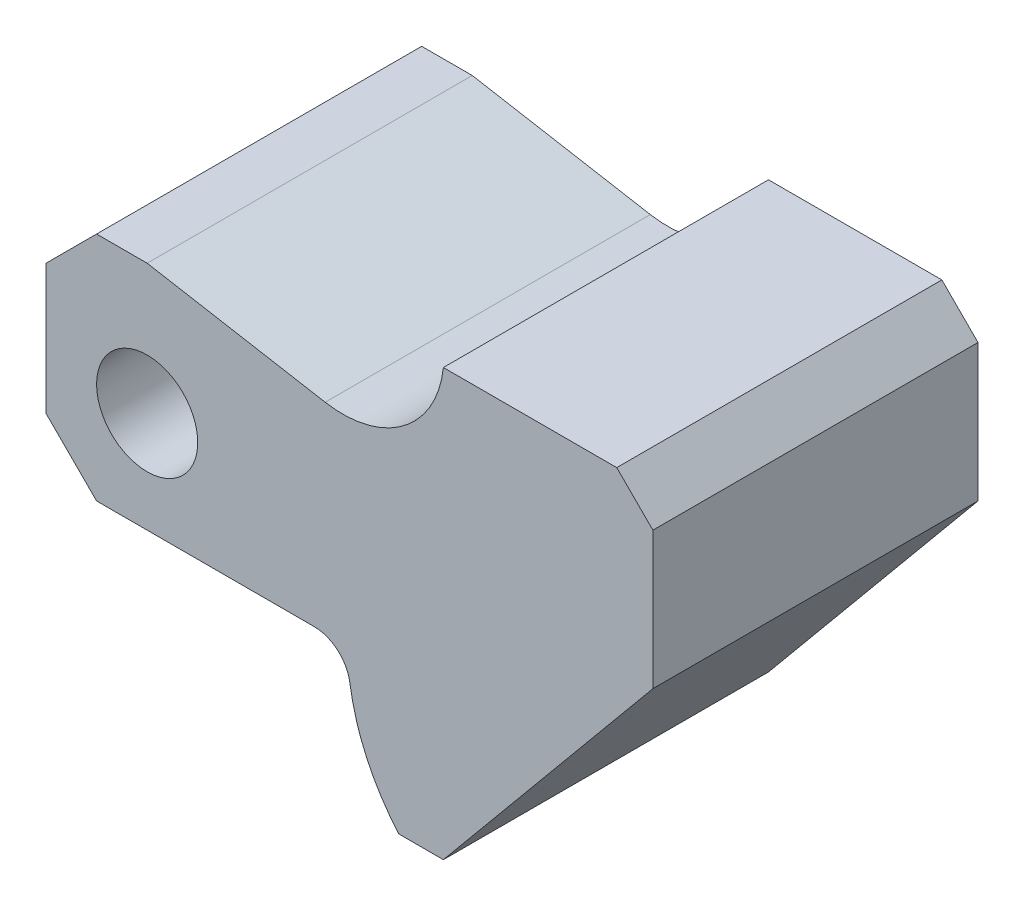
ISO-10303-21;
HEADER;
FILE_DESCRIPTION(('STEP AP214'),'2;1');
FILE_NAME('part.step','',(''),(''),'','','');
FILE_SCHEMA(('AUTOMOTIVE_DESIGN { 1 0 10303 214 1 1 1 1 }'));
ENDSEC;
DATA;
#1=APPLICATION_CONTEXT('core data for automotive mechanical design processes');
#2=APPLICATION_PROTOCOL_DEFINITION('international standard','automotive_design',2000,#1);
#3=PRODUCT_CONTEXT('',#1,'mechanical');
#4=PRODUCT('Part','Part','',(#3));
#5=PRODUCT_RELATED_PRODUCT_CATEGORY('part','',(#4));
#6=PRODUCT_DEFINITION_FORMATION('','',#4);
#7=PRODUCT_DEFINITION_CONTEXT('part definition',#1,'design');
#8=PRODUCT_DEFINITION('design','',#6,#7);
#9=PRODUCT_DEFINITION_SHAPE('','',#8);
#10=(LENGTH_UNIT() NAMED_UNIT(*) SI_UNIT(.MILLI.,.METRE.));
#11=(NAMED_UNIT(*) PLANE_ANGLE_UNIT() SI_UNIT($,.RADIAN.));
#12=(NAMED_UNIT(*) SI_UNIT($,.STERADIAN.) SOLID_ANGLE_UNIT());
#13=UNCERTAINTY_MEASURE_WITH_UNIT(LENGTH_MEASURE(1.E-05),#10,'distance_accuracy_value','');
#14=(GEOMETRIC_REPRESENTATION_CONTEXT(3) GLOBAL_UNCERTAINTY_ASSIGNED_CONTEXT((#13)) GLOBAL_UNIT_ASSIGNED_CONTEXT((#10,
#11,#12)) REPRESENTATION_CONTEXT('',''));
#15=CARTESIAN_POINT('',(0.,0.,0.));
#16=DIRECTION('',(0.,0.,1.));
#17=DIRECTION('',(1.,0.,0.));
#18=AXIS2_PLACEMENT_3D('',#15,#16,#17);
#19=CARTESIAN_POINT('',(-42.867935385469,-6.63350003125649,45.));
#20=DIRECTION('',(0.,0.,-1.));
#21=DIRECTION('',(-1.,0.,0.));
#22=AXIS2_PLACEMENT_3D('',#19,#20,#21);
#23=CYLINDRICAL_SURFACE('',#22,5.);
#24=CARTESIAN_POINT('',(-42.867935385469,-6.63350003125649,0.));
#25=DIRECTION('',(0.,0.,1.));
#26=DIRECTION('',(1.,0.,0.));
#27=AXIS2_PLACEMENT_3D('',#24,#25,#26);
#28=CIRCLE('',#27,5.);
#29=CARTESIAN_POINT('',(-42.867935385469,-1.63350003125649,0.));
#30=VERTEX_POINT('',#29);
#31=CARTESIAN_POINT('',(-37.9222966440572,-5.89820591360943,0.));
#32=VERTEX_POINT('',#31);
#33=EDGE_CURVE('E184',#30,#32,#28,.F.);
#34=ORIENTED_EDGE('',*,*,#33,.T.);
#35=DIRECTION('',(0.,0.,-1.));
#36=VECTOR('',#35,1.);
#37=CARTESIAN_POINT('',(-37.9222966440572,-5.89820591360943,45.));
#38=LINE('',#37,#36);
#39=CARTESIAN_POINT('',(-37.9222966440572,-5.89820591360943,45.));
#40=VERTEX_POINT('',#39);
#41=EDGE_CURVE('E11',#40,#32,#38,.T.);
#42=ORIENTED_EDGE('',*,*,#41,.F.);
#43=CARTESIAN_POINT('',(-42.867935385469,-6.63350003125649,45.));
#44=DIRECTION('',(0.,0.,1.));
#45=DIRECTION('',(1.,0.,0.));
#46=AXIS2_PLACEMENT_3D('',#43,#44,#45);
#47=CIRCLE('',#46,5.);
#48=CARTESIAN_POINT('',(-42.867935385469,-1.63350003125649,45.));
#49=VERTEX_POINT('',#48);
#50=EDGE_CURVE('E431',#49,#40,#47,.F.);
#51=ORIENTED_EDGE('',*,*,#50,.F.);
#52=DIRECTION('',(0.,0.,-1.));
#53=VECTOR('',#52,1.);
#54=CARTESIAN_POINT('',(-42.867935385469,-1.63350003125649,45.));
#55=LINE('',#54,#53);
#56=EDGE_CURVE('E176',#49,#30,#55,.T.);
#57=ORIENTED_EDGE('',*,*,#56,.T.);
#58=EDGE_LOOP('',(#34,#42,#51,#57));
#59=FACE_BOUND('',#58,.T.);
#60=ADVANCED_FACE('F41',(#59),#23,.F.);
#61=CARTESIAN_POINT('',(-9.23759194386856,-1.63350003125649,45.));
#62=DIRECTION('',(0.,0.,-1.));
#63=DIRECTION('',(-1.,0.,0.));
#64=AXIS2_PLACEMENT_3D('',#61,#62,#63);
#65=CYLINDRICAL_SURFACE('',#64,29.);
#66=CARTESIAN_POINT('',(-9.23759194386856,-1.63350003125649,0.));
#67=DIRECTION('',(0.,0.,1.));
#68=DIRECTION('',(1.,0.,0.));
#69=AXIS2_PLACEMENT_3D('',#66,#67,#68);
#70=CIRCLE('',#69,29.);
#71=CARTESIAN_POINT('',(-31.1464942440752,-20.6335000312565,0.));
#72=VERTEX_POINT('',#71);
#73=EDGE_CURVE('E188',#32,#72,#70,.T.);
#74=ORIENTED_EDGE('',*,*,#73,.T.);
#75=DIRECTION('',(0.,0.,-1.));
#76=VECTOR('',#75,1.);
#77=CARTESIAN_POINT('',(-31.1464942440752,-20.6335000312565,45.));
#78=LINE('',#77,#76);
#79=CARTESIAN_POINT('',(-31.1464942440752,-20.6335000312565,45.));
#80=VERTEX_POINT('',#79);
#81=EDGE_CURVE('E51',#80,#72,#78,.T.);
#82=ORIENTED_EDGE('',*,*,#81,.F.);
#83=CARTESIAN_POINT('',(-9.23759194386856,-1.63350003125649,45.));
#84=DIRECTION('',(0.,0.,1.));
#85=DIRECTION('',(1.,0.,0.));
#86=AXIS2_PLACEMENT_3D('',#83,#84,#85);
#87=CIRCLE('',#86,29.);
#88=EDGE_CURVE('E120',#40,#80,#87,.T.);
#89=ORIENTED_EDGE('',*,*,#88,.F.);
#90=ORIENTED_EDGE('',*,*,#41,.T.);
#91=EDGE_LOOP('',(#74,#82,#89,#90));
#92=FACE_BOUND('',#91,.T.);
#93=ADVANCED_FACE('F333',(#92),#65,.T.);
#94=CARTESIAN_POINT('',(0.,-20.6335000312565,45.));
#95=DIRECTION('',(0.,1.,0.));
#96=DIRECTION('',(0.,0.,1.));
#97=AXIS2_PLACEMENT_3D('',#94,#95,#96);
#98=PLANE('',#97);
#99=DIRECTION('',(1.,0.,0.));
#100=VECTOR('',#99,1.);
#101=CARTESIAN_POINT('',(0.,-20.6335000312565,0.));
#102=LINE('',#101,#100);
#103=CARTESIAN_POINT('',(-24.9804490867257,-20.6335000312565,0.));
#104=VERTEX_POINT('',#103);
#105=EDGE_CURVE('E191',#72,#104,#102,.T.);
#106=ORIENTED_EDGE('',*,*,#105,.T.);
#107=DIRECTION('',(0.,0.,-1.));
#108=VECTOR('',#107,1.);
#109=CARTESIAN_POINT('',(-24.9804490867257,-20.6335000312565,45.));
#110=LINE('',#109,#108);
#111=CARTESIAN_POINT('',(-24.9804490867257,-20.6335000312565,45.));
#112=VERTEX_POINT('',#111);
#113=EDGE_CURVE('E260',#112,#104,#110,.T.);
#114=ORIENTED_EDGE('',*,*,#113,.F.);
#115=DIRECTION('',(1.,0.,0.));
#116=VECTOR('',#115,1.);
#117=CARTESIAN_POINT('',(0.,-20.6335000312565,45.));
#118=LINE('',#117,#116);
#119=EDGE_CURVE('E269',#80,#112,#118,.T.);
#120=ORIENTED_EDGE('',*,*,#119,.F.);
#121=ORIENTED_EDGE('',*,*,#81,.T.);
#122=EDGE_LOOP('',(#106,#114,#120,#121));
#123=FACE_BOUND('',#122,.T.);
#124=ADVANCED_FACE('F267',(#123),#98,.F.);
#125=CARTESIAN_POINT('',(-4.67475682454678,3.87336994033876,45.));
#126=DIRECTION('',(0.770021560905562,-0.638017864750323,0.));
#127=DIRECTION('',(0.638017864750323,0.770021560905562,0.));
#128=AXIS2_PLACEMENT_3D('',#125,#126,#127);
#129=PLANE('',#128);
#130=DIRECTION('',(-0.638017864750323,-0.770021560905562,0.));
#131=VECTOR('',#130,1.);
#132=CARTESIAN_POINT('',(-4.67475682454678,3.87336994033876,0.));
#133=LINE('',#132,#131);
#134=CARTESIAN_POINT('',(4.0195509132743,14.3664999687435,0.));
#135=VERTEX_POINT('',#134);
#136=EDGE_CURVE('E195',#135,#104,#133,.T.);
#137=ORIENTED_EDGE('',*,*,#136,.F.);
#138=DIRECTION('',(0.,0.,-1.));
#139=VECTOR('',#138,1.);
#140=CARTESIAN_POINT('',(4.0195509132743,14.3664999687435,45.));
#141=LINE('',#140,#139);
#142=CARTESIAN_POINT('',(4.0195509132743,14.3664999687435,45.));
#143=VERTEX_POINT('',#142);
#144=EDGE_CURVE('E257',#143,#135,#141,.T.);
#145=ORIENTED_EDGE('',*,*,#144,.F.);
#146=DIRECTION('',(-0.638017864750323,-0.770021560905562,0.));
#147=VECTOR('',#146,1.);
#148=CARTESIAN_POINT('',(-4.67475682454678,3.87336994033876,45.));
#149=LINE('',#148,#147);
#150=EDGE_CURVE('E279',#143,#112,#149,.T.);
#151=ORIENTED_EDGE('',*,*,#150,.T.);
#152=ORIENTED_EDGE('',*,*,#113,.T.);
#153=EDGE_LOOP('',(#137,#145,#151,#152));
#154=FACE_BOUND('',#153,.T.);
#155=ADVANCED_FACE('F276',(#154),#129,.T.);
#156=CARTESIAN_POINT('',(4.0195509132743,0.,45.));
#157=DIRECTION('',(1.,0.,0.));
#158=DIRECTION('',(0.,1.,0.));
#159=AXIS2_PLACEMENT_3D('',#156,#157,#158);
#160=PLANE('',#159);
#161=DIRECTION('',(0.,-1.,0.));
#162=VECTOR('',#161,1.);
#163=CARTESIAN_POINT('',(4.0195509132743,0.,0.));
#164=LINE('',#163,#162);
#165=CARTESIAN_POINT('',(4.0195509132743,33.3664999687435,0.));
#166=VERTEX_POINT('',#165);
#167=EDGE_CURVE('E199',#166,#135,#164,.T.);
#168=ORIENTED_EDGE('',*,*,#167,.F.);
#169=DIRECTION('',(0.,0.,-1.));
#170=VECTOR('',#169,1.);
#171=CARTESIAN_POINT('',(4.0195509132743,33.3664999687435,45.));
#172=LINE('',#171,#170);
#173=CARTESIAN_POINT('',(4.0195509132743,33.3664999687435,45.));
#174=VERTEX_POINT('',#173);
#175=EDGE_CURVE('E254',#174,#166,#172,.T.);
#176=ORIENTED_EDGE('',*,*,#175,.F.);
#177=DIRECTION('',(0.,-1.,0.));
#178=VECTOR('',#177,1.);
#179=CARTESIAN_POINT('',(4.0195509132743,0.,45.));
#180=LINE('',#179,#178);
#181=EDGE_CURVE('E283',#174,#143,#180,.T.);
#182=ORIENTED_EDGE('',*,*,#181,.T.);
#183=ORIENTED_EDGE('',*,*,#144,.T.);
#184=EDGE_LOOP('',(#168,#176,#182,#183));
#185=FACE_BOUND('',#184,.T.);
#186=ADVANCED_FACE('F344',(#185),#160,.T.);
#187=CARTESIAN_POINT('',(18.6930254410089,18.6930254410089,45.));
#188=DIRECTION('',(0.707106781186547,0.707106781186547,0.));
#189=DIRECTION('',(-0.707106781186548,0.707106781186548,0.));
#190=AXIS2_PLACEMENT_3D('',#187,#188,#189);
#191=PLANE('',#190);
#192=DIRECTION('',(0.707106781186548,-0.707106781186548,0.));
#193=VECTOR('',#192,1.);
#194=CARTESIAN_POINT('',(18.6930254410089,18.6930254410089,0.));
#195=LINE('',#194,#193);
#196=CARTESIAN_POINT('',(-0.9804490867257,38.3664999687435,0.));
#197=VERTEX_POINT('',#196);
#198=EDGE_CURVE('E203',#197,#166,#195,.T.);
#199=ORIENTED_EDGE('',*,*,#198,.F.);
#200=DIRECTION('',(0.,0.,-1.));
#201=VECTOR('',#200,1.);
#202=CARTESIAN_POINT('',(-0.9804490867257,38.3664999687435,45.));
#203=LINE('',#202,#201);
#204=CARTESIAN_POINT('',(-0.9804490867257,38.3664999687435,45.));
#205=VERTEX_POINT('',#204);
#206=EDGE_CURVE('E251',#205,#197,#203,.T.);
#207=ORIENTED_EDGE('',*,*,#206,.F.);
#208=DIRECTION('',(0.707106781186548,-0.707106781186548,0.));
#209=VECTOR('',#208,1.);
#210=CARTESIAN_POINT('',(18.6930254410089,18.6930254410089,45.));
#211=LINE('',#210,#209);
#212=EDGE_CURVE('E287',#205,#174,#211,.T.);
#213=ORIENTED_EDGE('',*,*,#212,.T.);
#214=ORIENTED_EDGE('',*,*,#175,.T.);
#215=EDGE_LOOP('',(#199,#207,#213,#214));
#216=FACE_BOUND('',#215,.T.);
#217=ADVANCED_FACE('F347',(#216),#191,.T.);
#218=CARTESIAN_POINT('',(0.,38.3664999687435,45.));
#219=DIRECTION('',(0.,1.,0.));
#220=DIRECTION('',(0.,0.,1.));
#221=AXIS2_PLACEMENT_3D('',#218,#219,#220);
#222=PLANE('',#221);
#223=DIRECTION('',(1.,0.,0.));
#224=VECTOR('',#223,1.);
#225=CARTESIAN_POINT('',(0.,38.3664999687435,0.));
#226=LINE('',#225,#224);
#227=CARTESIAN_POINT('',(-24.9804490867257,38.3664999687435,0.));
#228=VERTEX_POINT('',#227);
#229=EDGE_CURVE('E207',#228,#197,#226,.T.);
#230=ORIENTED_EDGE('',*,*,#229,.F.);
#231=DIRECTION('',(0.,0.,-1.));
#232=VECTOR('',#231,1.);
#233=CARTESIAN_POINT('',(-24.9804490867257,38.3664999687435,45.));
#234=LINE('',#233,#232);
#235=CARTESIAN_POINT('',(-24.9804490867257,38.3664999687435,45.));
#236=VERTEX_POINT('',#235);
#237=EDGE_CURVE('E248',#236,#228,#234,.T.);
#238=ORIENTED_EDGE('',*,*,#237,.F.);
#239=DIRECTION('',(1.,0.,0.));
#240=VECTOR('',#239,1.);
#241=CARTESIAN_POINT('',(0.,38.3664999687435,45.));
#242=LINE('',#241,#240);
#243=EDGE_CURVE('E295',#236,#205,#242,.T.);
#244=ORIENTED_EDGE('',*,*,#243,.T.);
#245=ORIENTED_EDGE('',*,*,#206,.T.);
#246=EDGE_LOOP('',(#230,#238,#244,#245));
#247=FACE_BOUND('',#246,.T.);
#248=ADVANCED_FACE('F351',(#247),#222,.T.);
#249=CARTESIAN_POINT('',(-38.9059865860506,39.8085143080953,45.));
#250=DIRECTION('',(0.,0.,-1.));
#251=DIRECTION('',(-1.,0.,0.));
#252=AXIS2_PLACEMENT_3D('',#249,#250,#251);
#253=CYLINDRICAL_SURFACE('',#252,14.);
#254=CARTESIAN_POINT('',(-38.9059865860506,39.8085143080953,0.));
#255=DIRECTION('',(0.,0.,1.));
#256=DIRECTION('',(1.,0.,0.));
#257=AXIS2_PLACEMENT_3D('',#254,#255,#256);
#258=CIRCLE('',#257,14.);
#259=CARTESIAN_POINT('',(-41.3370610733876,26.0212057659244,0.));
#260=VERTEX_POINT('',#259);
#261=EDGE_CURVE('E211',#260,#228,#258,.T.);
#262=ORIENTED_EDGE('',*,*,#261,.F.);
#263=DIRECTION('',(0.,0.,-1.));
#264=VECTOR('',#263,1.);
#265=CARTESIAN_POINT('',(-41.3370610733876,26.0212057659244,45.));
#266=LINE('',#265,#264);
#267=CARTESIAN_POINT('',(-41.3370610733876,26.0212057659244,45.));
#268=VERTEX_POINT('',#267);
#269=EDGE_CURVE('E245',#268,#260,#266,.T.);
#270=ORIENTED_EDGE('',*,*,#269,.F.);
#271=CARTESIAN_POINT('',(-38.9059865860506,39.8085143080953,45.));
#272=DIRECTION('',(0.,0.,1.));
#273=DIRECTION('',(1.,0.,0.));
#274=AXIS2_PLACEMENT_3D('',#271,#272,#273);
#275=CIRCLE('',#274,14.);
#276=EDGE_CURVE('E299',#268,#236,#275,.T.);
#277=ORIENTED_EDGE('',*,*,#276,.T.);
#278=ORIENTED_EDGE('',*,*,#237,.T.);
#279=EDGE_LOOP('',(#262,#270,#277,#278));
#280=FACE_BOUND('',#279,.T.);
#281=ADVANCED_FACE('F355',(#280),#253,.F.);
#282=CARTESIAN_POINT('',(3.20342335390967,18.1675166275667,45.));
#283=DIRECTION('',(0.173648177666931,0.984807753012208,0.));
#284=DIRECTION('',(-0.984807753012208,0.173648177666931,0.));
#285=AXIS2_PLACEMENT_3D('',#282,#283,#284);
#286=PLANE('',#285);
#287=DIRECTION('',(0.984807753012208,-0.173648177666931,0.));
#288=VECTOR('',#287,1.);
#289=CARTESIAN_POINT('',(3.20342335390967,18.1675166275667,0.));
#290=LINE('',#289,#288);
#291=CARTESIAN_POINT('',(-65.9804490867257,30.3664999687435,0.));
#292=VERTEX_POINT('',#291);
#293=EDGE_CURVE('E215',#292,#260,#290,.T.);
#294=ORIENTED_EDGE('',*,*,#293,.F.);
#295=DIRECTION('',(0.,0.,-1.));
#296=VECTOR('',#295,1.);
#297=CARTESIAN_POINT('',(-65.9804490867257,30.3664999687435,45.));
#298=LINE('',#297,#296);
#299=CARTESIAN_POINT('',(-65.9804490867257,30.3664999687435,45.));
#300=VERTEX_POINT('',#299);
#301=EDGE_CURVE('E242',#300,#292,#298,.T.);
#302=ORIENTED_EDGE('',*,*,#301,.F.);
#303=DIRECTION('',(0.984807753012208,-0.173648177666931,0.));
#304=VECTOR('',#303,1.);
#305=CARTESIAN_POINT('',(3.20342335390967,18.1675166275667,45.));
#306=LINE('',#305,#304);
#307=EDGE_CURVE('E303',#300,#268,#306,.T.);
#308=ORIENTED_EDGE('',*,*,#307,.T.);
#309=ORIENTED_EDGE('',*,*,#269,.T.);
#310=EDGE_LOOP('',(#294,#302,#308,#309));
#311=FACE_BOUND('',#310,.T.);
#312=ADVANCED_FACE('F319',(#311),#286,.T.);
#313=CARTESIAN_POINT('',(0.,30.3664999687435,45.));
#314=DIRECTION('',(0.,1.,0.));
#315=DIRECTION('',(0.,0.,1.));
#316=AXIS2_PLACEMENT_3D('',#313,#314,#315);
#317=PLANE('',#316);
#318=DIRECTION('',(1.,0.,0.));
#319=VECTOR('',#318,1.);
#320=CARTESIAN_POINT('',(0.,30.3664999687435,0.));
#321=LINE('',#320,#319);
#322=CARTESIAN_POINT('',(-72.9804490867257,30.3664999687435,0.));
#323=VERTEX_POINT('',#322);
#324=EDGE_CURVE('E219',#323,#292,#321,.T.);
#325=ORIENTED_EDGE('',*,*,#324,.F.);
#326=DIRECTION('',(0.,0.,-1.));
#327=VECTOR('',#326,1.);
#328=CARTESIAN_POINT('',(-72.9804490867257,30.3664999687435,45.));
#329=LINE('',#328,#327);
#330=CARTESIAN_POINT('',(-72.9804490867257,30.3664999687435,45.));
#331=VERTEX_POINT('',#330);
#332=EDGE_CURVE('E239',#331,#323,#329,.T.);
#333=ORIENTED_EDGE('',*,*,#332,.F.);
#334=DIRECTION('',(1.,0.,0.));
#335=VECTOR('',#334,1.);
#336=CARTESIAN_POINT('',(0.,30.3664999687435,45.));
#337=LINE('',#336,#335);
#338=EDGE_CURVE('E307',#331,#300,#337,.T.);
#339=ORIENTED_EDGE('',*,*,#338,.T.);
#340=ORIENTED_EDGE('',*,*,#301,.T.);
#341=EDGE_LOOP('',(#325,#333,#339,#340));
#342=FACE_BOUND('',#341,.T.);
#343=ADVANCED_FACE('F313',(#342),#317,.T.);
#344=CARTESIAN_POINT('',(-51.6734745277346,51.6734745277346,45.));
#345=DIRECTION('',(0.707106781186548,-0.707106781186547,0.));
#346=DIRECTION('',(0.707106781186547,0.707106781186548,0.));
#347=AXIS2_PLACEMENT_3D('',#344,#345,#346);
#348=PLANE('',#347);
#349=DIRECTION('',(-0.707106781186547,-0.707106781186548,0.));
#350=VECTOR('',#349,1.);
#351=CARTESIAN_POINT('',(-51.6734745277346,51.6734745277346,0.));
#352=LINE('',#351,#350);
#353=CARTESIAN_POINT('',(-79.9804490867257,23.3664999687435,0.));
#354=VERTEX_POINT('',#353);
#355=EDGE_CURVE('E223',#323,#354,#352,.T.);
#356=ORIENTED_EDGE('',*,*,#355,.T.);
#357=DIRECTION('',(0.,0.,-1.));
#358=VECTOR('',#357,1.);
#359=CARTESIAN_POINT('',(-79.9804490867257,23.3664999687435,45.));
#360=LINE('',#359,#358);
#361=CARTESIAN_POINT('',(-79.9804490867257,23.3664999687435,45.));
#362=VERTEX_POINT('',#361);
#363=EDGE_CURVE('E169',#362,#354,#360,.T.);
#364=ORIENTED_EDGE('',*,*,#363,.F.);
#365=DIRECTION('',(-0.707106781186547,-0.707106781186548,0.));
#366=VECTOR('',#365,1.);
#367=CARTESIAN_POINT('',(-51.6734745277346,51.6734745277346,45.));
#368=LINE('',#367,#366);
#369=EDGE_CURVE('E158',#331,#362,#368,.T.);
#370=ORIENTED_EDGE('',*,*,#369,.F.);
#371=ORIENTED_EDGE('',*,*,#332,.T.);
#372=EDGE_LOOP('',(#356,#364,#370,#371));
#373=FACE_BOUND('',#372,.T.);
#374=ADVANCED_FACE('F323',(#373),#348,.F.);
#375=CARTESIAN_POINT('',(-79.9804490867257,0.,45.));
#376=DIRECTION('',(1.,0.,0.));
#377=DIRECTION('',(0.,1.,0.));
#378=AXIS2_PLACEMENT_3D('',#375,#376,#377);
#379=PLANE('',#378);
#380=DIRECTION('',(0.,-1.,0.));
#381=VECTOR('',#380,1.);
#382=CARTESIAN_POINT('',(-79.9804490867257,0.,0.));
#383=LINE('',#382,#381);
#384=CARTESIAN_POINT('',(-79.9804490867257,5.36649996874351,0.));
#385=VERTEX_POINT('',#384);
#386=EDGE_CURVE('E167',#354,#385,#383,.T.);
#387=ORIENTED_EDGE('',*,*,#386,.T.);
#388=DIRECTION('',(0.,0.,-1.));
#389=VECTOR('',#388,1.);
#390=CARTESIAN_POINT('',(-79.9804490867257,5.36649996874351,45.));
#391=LINE('',#390,#389);
#392=CARTESIAN_POINT('',(-79.9804490867257,5.36649996874351,45.));
#393=VERTEX_POINT('',#392);
#394=EDGE_CURVE('E164',#393,#385,#391,.T.);
#395=ORIENTED_EDGE('',*,*,#394,.F.);
#396=DIRECTION('',(0.,-1.,0.));
#397=VECTOR('',#396,1.);
#398=CARTESIAN_POINT('',(-79.9804490867257,0.,45.));
#399=LINE('',#398,#397);
#400=EDGE_CURVE('E151',#362,#393,#399,.T.);
#401=ORIENTED_EDGE('',*,*,#400,.F.);
#402=ORIENTED_EDGE('',*,*,#363,.T.);
#403=EDGE_LOOP('',(#387,#395,#401,#402));
#404=FACE_BOUND('',#403,.T.);
#405=ADVANCED_FACE('F165',(#404),#379,.F.);
#406=CARTESIAN_POINT('',(-37.306974558991,-37.3069745589911,45.));
#407=DIRECTION('',(0.707106781186546,0.707106781186548,0.));
#408=DIRECTION('',(-0.707106781186549,0.707106781186547,0.));
#409=AXIS2_PLACEMENT_3D('',#406,#407,#408);
#410=PLANE('',#409);
#411=DIRECTION('',(0.707106781186549,-0.707106781186547,0.));
#412=VECTOR('',#411,1.);
#413=CARTESIAN_POINT('',(-37.306974558991,-37.3069745589911,0.));
#414=LINE('',#413,#412);
#415=CARTESIAN_POINT('',(-72.9804490867257,-1.63350003125649,0.));
#416=VERTEX_POINT('',#415);
#417=EDGE_CURVE('E106',#385,#416,#414,.T.);
#418=ORIENTED_EDGE('',*,*,#417,.T.);
#419=DIRECTION('',(0.,0.,-1.));
#420=VECTOR('',#419,1.);
#421=CARTESIAN_POINT('',(-72.9804490867257,-1.63350003125649,45.));
#422=LINE('',#421,#420);
#423=CARTESIAN_POINT('',(-72.9804490867257,-1.63350003125649,45.));
#424=VERTEX_POINT('',#423);
#425=EDGE_CURVE('E170',#424,#416,#422,.T.);
#426=ORIENTED_EDGE('',*,*,#425,.F.);
#427=DIRECTION('',(0.707106781186549,-0.707106781186547,0.));
#428=VECTOR('',#427,1.);
#429=CARTESIAN_POINT('',(-37.306974558991,-37.3069745589911,45.));
#430=LINE('',#429,#428);
#431=EDGE_CURVE('E155',#393,#424,#430,.T.);
#432=ORIENTED_EDGE('',*,*,#431,.F.);
#433=ORIENTED_EDGE('',*,*,#394,.T.);
#434=EDGE_LOOP('',(#418,#426,#432,#433));
#435=FACE_BOUND('',#434,.T.);
#436=ADVANCED_FACE('F172',(#435),#410,.F.);
#437=CARTESIAN_POINT('',(-65.9804490867257,12.3664999687435,45.));
#438=DIRECTION('',(0.,0.,-1.));
#439=DIRECTION('',(-1.,0.,0.));
#440=AXIS2_PLACEMENT_3D('',#437,#438,#439);
#441=CYLINDRICAL_SURFACE('',#440,7.);
#442=CARTESIAN_POINT('',(-65.9804490867257,12.3664999687435,45.));
#443=DIRECTION('',(0.,0.,1.));
#444=DIRECTION('',(1.,0.,0.));
#445=AXIS2_PLACEMENT_3D('',#442,#443,#444);
#446=CIRCLE('',#445,7.);
#447=CARTESIAN_POINT('',(-72.9804490867257,12.3664999687435,45.));
#448=VERTEX_POINT('',#447);
#449=EDGE_CURVE('E232',#448,#448,#446,.T.);
#450=CARTESIAN_POINT('',(-65.9804490867257,12.3664999687435,0.));
#451=DIRECTION('',(0.,0.,1.));
#452=DIRECTION('',(1.,0.,0.));
#453=AXIS2_PLACEMENT_3D('',#450,#451,#452);
#454=CIRCLE('',#453,7.);
#455=CARTESIAN_POINT('',(-72.9804490867257,12.3664999687435,0.));
#456=VERTEX_POINT('',#455);
#457=EDGE_CURVE('E180',#456,#456,#454,.T.);
#458=CARTESIAN_POINT('',(-72.9804490867257,12.3664999687435,45.));
#459=CARTESIAN_POINT('',(-72.9804490867257,12.3664999687435,44.53125));
#460=CARTESIAN_POINT('',(-72.9804490867257,12.3664999687435,44.0625));
#461=CARTESIAN_POINT('',(-72.9804490867257,12.3664999687435,43.125));
#462=CARTESIAN_POINT('',(-72.9804490867257,12.3664999687435,42.65625));
#463=CARTESIAN_POINT('',(-72.9804490867257,12.3664999687435,41.71875));
#464=CARTESIAN_POINT('',(-72.9804490867257,12.3664999687435,41.25));
#465=CARTESIAN_POINT('',(-72.9804490867257,12.3664999687435,40.3125));
#466=CARTESIAN_POINT('',(-72.9804490867257,12.3664999687435,39.84375));
#467=CARTESIAN_POINT('',(-72.9804490867257,12.3664999687435,38.90625));
#468=CARTESIAN_POINT('',(-72.9804490867257,12.3664999687435,38.4375));
#469=CARTESIAN_POINT('',(-72.9804490867257,12.3664999687435,37.5));
#470=CARTESIAN_POINT('',(-72.9804490867257,12.3664999687435,37.03125));
#471=CARTESIAN_POINT('',(-72.9804490867257,12.3664999687435,36.09375));
#472=CARTESIAN_POINT('',(-72.9804490867257,12.3664999687435,35.625));
#473=CARTESIAN_POINT('',(-72.9804490867257,12.3664999687435,34.6875));
#474=CARTESIAN_POINT('',(-72.9804490867257,12.3664999687435,34.21875));
#475=CARTESIAN_POINT('',(-72.9804490867257,12.3664999687435,33.28125));
#476=CARTESIAN_POINT('',(-72.9804490867257,12.3664999687435,32.8125));
#477=CARTESIAN_POINT('',(-72.9804490867257,12.3664999687435,31.875));
#478=CARTESIAN_POINT('',(-72.9804490867257,12.3664999687435,31.40625));
#479=CARTESIAN_POINT('',(-72.9804490867257,12.3664999687435,30.46875));
#480=CARTESIAN_POINT('',(-72.9804490867257,12.3664999687435,30.));
#481=CARTESIAN_POINT('',(-72.9804490867257,12.3664999687435,29.0625));
#482=CARTESIAN_POINT('',(-72.9804490867257,12.3664999687435,28.59375));
#483=CARTESIAN_POINT('',(-72.9804490867257,12.3664999687435,27.65625));
#484=CARTESIAN_POINT('',(-72.9804490867257,12.3664999687435,27.1875));
#485=CARTESIAN_POINT('',(-72.9804490867257,12.3664999687435,26.25));
#486=CARTESIAN_POINT('',(-72.9804490867257,12.3664999687435,25.78125));
#487=CARTESIAN_POINT('',(-72.9804490867257,12.3664999687435,24.84375));
#488=CARTESIAN_POINT('',(-72.9804490867257,12.3664999687435,24.375));
#489=CARTESIAN_POINT('',(-72.9804490867257,12.3664999687435,23.4375));
#490=CARTESIAN_POINT('',(-72.9804490867257,12.3664999687435,22.96875));
#491=CARTESIAN_POINT('',(-72.9804490867257,12.3664999687435,22.03125));
#492=CARTESIAN_POINT('',(-72.9804490867257,12.3664999687435,21.5625));
#493=CARTESIAN_POINT('',(-72.9804490867257,12.3664999687435,20.625));
#494=CARTESIAN_POINT('',(-72.9804490867257,12.3664999687435,20.15625));
#495=CARTESIAN_POINT('',(-72.9804490867257,12.3664999687435,19.21875));
#496=CARTESIAN_POINT('',(-72.9804490867257,12.3664999687435,18.75));
#497=CARTESIAN_POINT('',(-72.9804490867257,12.3664999687435,17.8125));
#498=CARTESIAN_POINT('',(-72.9804490867257,12.3664999687435,17.34375));
#499=CARTESIAN_POINT('',(-72.9804490867257,12.3664999687435,16.40625));
#500=CARTESIAN_POINT('',(-72.9804490867257,12.3664999687435,15.9375));
#501=CARTESIAN_POINT('',(-72.9804490867257,12.3664999687435,15.));
#502=CARTESIAN_POINT('',(-72.9804490867257,12.3664999687435,14.53125));
#503=CARTESIAN_POINT('',(-72.9804490867257,12.3664999687435,13.59375));
#504=CARTESIAN_POINT('',(-72.9804490867257,12.3664999687435,13.125));
#505=CARTESIAN_POINT('',(-72.9804490867257,12.3664999687435,12.1875));
#506=CARTESIAN_POINT('',(-72.9804490867257,12.3664999687435,11.71875));
#507=CARTESIAN_POINT('',(-72.9804490867257,12.3664999687435,10.78125));
#508=CARTESIAN_POINT('',(-72.9804490867257,12.3664999687435,10.3125));
#509=CARTESIAN_POINT('',(-72.9804490867257,12.3664999687435,9.375));
#510=CARTESIAN_POINT('',(-72.9804490867257,12.3664999687435,8.90625));
#511=CARTESIAN_POINT('',(-72.9804490867257,12.3664999687435,7.96874999999999));
#512=CARTESIAN_POINT('',(-72.9804490867257,12.3664999687435,7.5));
#513=CARTESIAN_POINT('',(-72.9804490867257,12.3664999687435,6.5625));
#514=CARTESIAN_POINT('',(-72.9804490867257,12.3664999687435,6.09375));
#515=CARTESIAN_POINT('',(-72.9804490867257,12.3664999687435,5.15625));
#516=CARTESIAN_POINT('',(-72.9804490867257,12.3664999687435,4.68749999999999));
#517=CARTESIAN_POINT('',(-72.9804490867257,12.3664999687435,3.74999999999999));
#518=CARTESIAN_POINT('',(-72.9804490867257,12.3664999687435,3.28124999999999));
#519=CARTESIAN_POINT('',(-72.9804490867257,12.3664999687435,2.34374999999999));
#520=CARTESIAN_POINT('',(-72.9804490867257,12.3664999687435,1.87499999999999));
#521=CARTESIAN_POINT('',(-72.9804490867257,12.3664999687435,0.937499999999992));
#522=CARTESIAN_POINT('',(-72.9804490867257,12.3664999687435,0.468749999999993));
#523=CARTESIAN_POINT('',(-72.9804490867257,12.3664999687435,0.));
#524=B_SPLINE_CURVE_WITH_KNOTS('',3,(#458,#459,#460,#461,#462,#463,#464,#465,#466,#467,#468,
#469,#470,#471,#472,#473,#474,#475,#476,#477,#478,#479,#480,#481,#482,#483,#484,#485,#486,#487,
#488,#489,#490,#491,#492,#493,#494,#495,#496,#497,#498,#499,#500,#501,#502,#503,#504,#505,#506,
#507,#508,#509,#510,#511,#512,#513,#514,#515,#516,#517,#518,#519,#520,#521,#522,#523),
.UNSPECIFIED.,.F.,.F.,(4,2,2,2,2,2,2,2,2,2,2,2,2,2,2,2,2,2,2,2,2,2,2,2,2,2,2,2,2,2,2,2,4),(0.,
1.40625,2.8125,4.21875000000001,5.62500000000001,7.03125,8.4375,9.84375000000001,11.25,12.65625,
14.0625,15.46875,16.875,18.28125,19.6875,21.09375,22.5,23.90625,25.3125,26.71875,28.125,
29.53125,30.9375,32.34375,33.75,35.15625,36.5625,37.96875,39.375,40.78125,42.1875,43.59375,45.),.UNSPECIFIED.);
#525=EDGE_CURVE('BSEAM43',#448,#456,#524,.T.);
#526=ORIENTED_EDGE('',*,*,#449,.T.);
#527=ORIENTED_EDGE('',*,*,#457,.F.);
#528=ORIENTED_EDGE('',*,*,#525,.T.);
#529=ORIENTED_EDGE('',*,*,#525,.F.);
#530=EDGE_LOOP('',(#526,#528,#527,#529));
#531=FACE_BOUND('',#530,.T.);
#532=ADVANCED_FACE('F43',(#531),#441,.F.);
#533=CARTESIAN_POINT('',(0.,-1.63350003125649,45.));
#534=DIRECTION('',(0.,1.,0.));
#535=DIRECTION('',(0.,0.,1.));
#536=AXIS2_PLACEMENT_3D('',#533,#534,#535);
#537=PLANE('',#536);
#538=DIRECTION('',(1.,0.,0.));
#539=VECTOR('',#538,1.);
#540=CARTESIAN_POINT('',(0.,-1.63350003125649,0.));
#541=LINE('',#540,#539);
#542=EDGE_CURVE('E112',#416,#30,#541,.T.);
#543=ORIENTED_EDGE('',*,*,#542,.T.);
#544=ORIENTED_EDGE('',*,*,#56,.F.);
#545=DIRECTION('',(1.,0.,0.));
#546=VECTOR('',#545,1.);
#547=CARTESIAN_POINT('',(0.,-1.63350003125649,45.));
#548=LINE('',#547,#546);
#549=EDGE_CURVE('E59',#424,#49,#548,.T.);
#550=ORIENTED_EDGE('',*,*,#549,.F.);
#551=ORIENTED_EDGE('',*,*,#425,.T.);
#552=EDGE_LOOP('',(#543,#544,#550,#551));
#553=FACE_BOUND('',#552,.T.);
#554=ADVANCED_FACE('F396',(#553),#537,.F.);
#555=CARTESIAN_POINT('',(0.,0.,45.));
#556=DIRECTION('',(0.,0.,1.));
#557=DIRECTION('',(1.,0.,0.));
#558=AXIS2_PLACEMENT_3D('',#555,#556,#557);
#559=PLANE('',#558);
#560=ORIENTED_EDGE('',*,*,#449,.F.);
#561=EDGE_LOOP('',(#560));
#562=FACE_BOUND('',#561,.T.);
#563=ORIENTED_EDGE('',*,*,#50,.T.);
#564=ORIENTED_EDGE('',*,*,#88,.T.);
#565=ORIENTED_EDGE('',*,*,#119,.T.);
#566=ORIENTED_EDGE('',*,*,#150,.F.);
#567=ORIENTED_EDGE('',*,*,#181,.F.);
#568=ORIENTED_EDGE('',*,*,#212,.F.);
#569=ORIENTED_EDGE('',*,*,#243,.F.);
#570=ORIENTED_EDGE('',*,*,#276,.F.);
#571=ORIENTED_EDGE('',*,*,#307,.F.);
#572=ORIENTED_EDGE('',*,*,#338,.F.);
#573=ORIENTED_EDGE('',*,*,#369,.T.);
#574=ORIENTED_EDGE('',*,*,#400,.T.);
#575=ORIENTED_EDGE('',*,*,#431,.T.);
#576=ORIENTED_EDGE('',*,*,#549,.T.);
#577=EDGE_LOOP('',(#563,#564,#565,#566,#567,#568,#569,#570,#571,#572,#573,#574,#575,#576));
#578=FACE_BOUND('',#577,.T.);
#579=ADVANCED_FACE('F153',(#562,#578),#559,.T.);
#580=CARTESIAN_POINT('',(0.,0.,0.));
#581=DIRECTION('',(0.,0.,1.));
#582=DIRECTION('',(1.,0.,0.));
#583=AXIS2_PLACEMENT_3D('',#580,#581,#582);
#584=PLANE('',#583);
#585=ORIENTED_EDGE('',*,*,#457,.T.);
#586=EDGE_LOOP('',(#585));
#587=FACE_BOUND('',#586,.T.);
#588=ORIENTED_EDGE('',*,*,#33,.F.);
#589=ORIENTED_EDGE('',*,*,#542,.F.);
#590=ORIENTED_EDGE('',*,*,#417,.F.);
#591=ORIENTED_EDGE('',*,*,#386,.F.);
#592=ORIENTED_EDGE('',*,*,#355,.F.);
#593=ORIENTED_EDGE('',*,*,#324,.T.);
#594=ORIENTED_EDGE('',*,*,#293,.T.);
#595=ORIENTED_EDGE('',*,*,#261,.T.);
#596=ORIENTED_EDGE('',*,*,#229,.T.);
#597=ORIENTED_EDGE('',*,*,#198,.T.);
#598=ORIENTED_EDGE('',*,*,#167,.T.);
#599=ORIENTED_EDGE('',*,*,#136,.T.);
#600=ORIENTED_EDGE('',*,*,#105,.F.);
#601=ORIENTED_EDGE('',*,*,#73,.F.);
#602=EDGE_LOOP('',(#588,#589,#590,#591,#592,#593,#594,#595,#596,#597,#598,#599,#600,#601));
#603=FACE_BOUND('',#602,.T.);
#604=ADVANCED_FACE('F272',(#587,#603),#584,.F.);
#605=CLOSED_SHELL('',(#60,#93,#124,#155,#186,#217,#248,#281,#312,#343,#374,#405,#436,#532,#554,
#579,#604));
#606=MANIFOLD_SOLID_BREP('B2',#605);
#607=ADVANCED_BREP_SHAPE_REPRESENTATION('',(#18,#606),#14);
#608=SHAPE_DEFINITION_REPRESENTATION(#9,#607);
ENDSEC;
END-ISO-10303-21;
